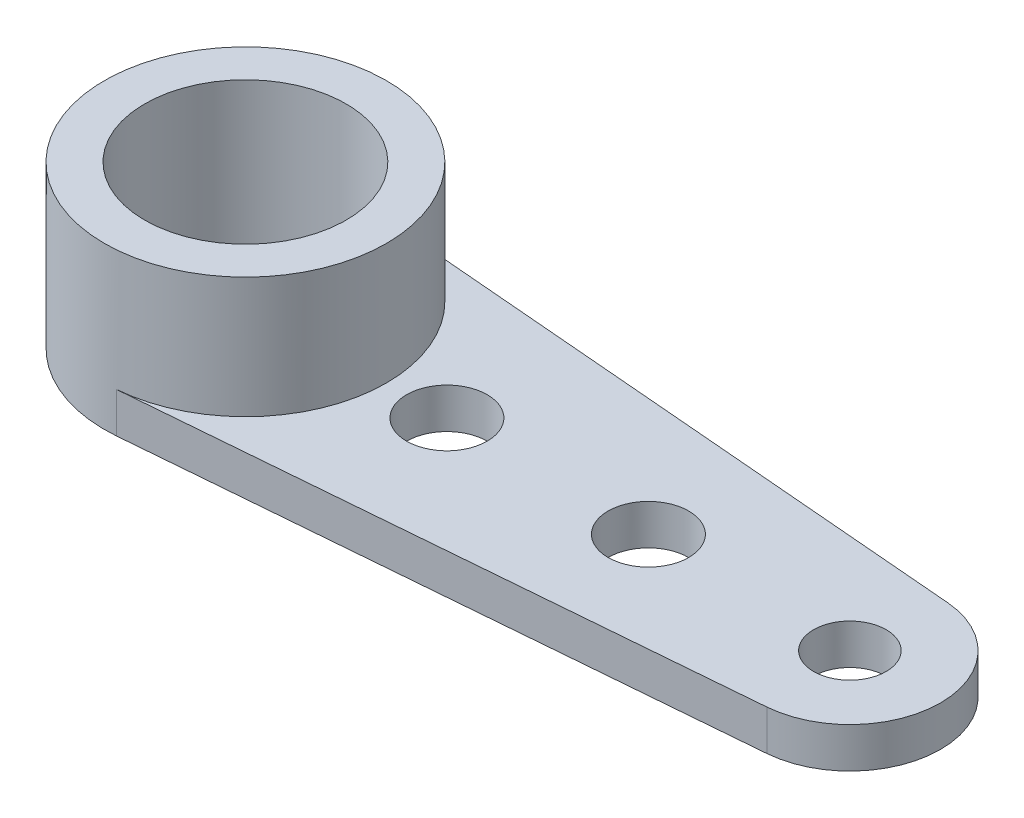
ISO-10303-21;
HEADER;
FILE_DESCRIPTION(('STEP AP214'),'2;1');
FILE_NAME('part.step','',(''),(''),'','','');
FILE_SCHEMA(('AUTOMOTIVE_DESIGN { 1 0 10303 214 1 1 1 1 }'));
ENDSEC;
DATA;
#1=APPLICATION_CONTEXT('core data for automotive mechanical design processes');
#2=APPLICATION_PROTOCOL_DEFINITION('international standard','automotive_design',2000,#1);
#3=PRODUCT_CONTEXT('',#1,'mechanical');
#4=PRODUCT('Part','Part','',(#3));
#5=PRODUCT_RELATED_PRODUCT_CATEGORY('part','',(#4));
#6=PRODUCT_DEFINITION_FORMATION('','',#4);
#7=PRODUCT_DEFINITION_CONTEXT('part definition',#1,'design');
#8=PRODUCT_DEFINITION('design','',#6,#7);
#9=PRODUCT_DEFINITION_SHAPE('','',#8);
#10=(LENGTH_UNIT() NAMED_UNIT(*) SI_UNIT(.MILLI.,.METRE.));
#11=(NAMED_UNIT(*) PLANE_ANGLE_UNIT() SI_UNIT($,.RADIAN.));
#12=(NAMED_UNIT(*) SI_UNIT($,.STERADIAN.) SOLID_ANGLE_UNIT());
#13=UNCERTAINTY_MEASURE_WITH_UNIT(LENGTH_MEASURE(1.E-05),#10,'distance_accuracy_value','');
#14=(GEOMETRIC_REPRESENTATION_CONTEXT(3) GLOBAL_UNCERTAINTY_ASSIGNED_CONTEXT((#13)) GLOBAL_UNIT_ASSIGNED_CONTEXT((#10,
#11,#12)) REPRESENTATION_CONTEXT('',''));
#15=CARTESIAN_POINT('',(0.,0.,0.));
#16=DIRECTION('',(0.,0.,1.));
#17=DIRECTION('',(1.,0.,0.));
#18=AXIS2_PLACEMENT_3D('',#15,#16,#17);
#19=CARTESIAN_POINT('',(0.291666666666666,1.,3.48782605007124));
#20=DIRECTION('',(-0.0833333333333333,0.,-0.996521728591783));
#21=DIRECTION('',(-0.996521728591783,0.,0.0833333333333333));
#22=AXIS2_PLACEMENT_3D('',#19,#20,#21);
#23=PLANE('',#22);
#24=DIRECTION('',(0.996521728591783,0.,-0.0833333333333333));
#25=VECTOR('',#24,1.);
#26=CARTESIAN_POINT('',(0.291666666666666,0.,3.48782605007124));
#27=LINE('',#26,#25);
#28=CARTESIAN_POINT('',(0.291666666666667,0.,3.48782605007124));
#29=VERTEX_POINT('',#28);
#30=CARTESIAN_POINT('',(15.1875,0.,2.24217388933151));
#31=VERTEX_POINT('',#30);
#32=EDGE_CURVE('E119',#29,#31,#27,.T.);
#33=ORIENTED_EDGE('',*,*,#32,.T.);
#34=DIRECTION('',(0.,-1.,0.));
#35=VECTOR('',#34,1.);
#36=CARTESIAN_POINT('',(15.1875,1.,2.24217388933151));
#37=LINE('',#36,#35);
#38=CARTESIAN_POINT('',(15.1875,1.,2.24217388933151));
#39=VERTEX_POINT('',#38);
#40=EDGE_CURVE('E13',#39,#31,#37,.T.);
#41=ORIENTED_EDGE('',*,*,#40,.F.);
#42=DIRECTION('',(0.996521728591783,0.,-0.0833333333333333));
#43=VECTOR('',#42,1.);
#44=CARTESIAN_POINT('',(0.291666666666666,1.,3.48782605007124));
#45=LINE('',#44,#43);
#46=CARTESIAN_POINT('',(0.291666666666667,1.,3.48782605007124));
#47=VERTEX_POINT('',#46);
#48=EDGE_CURVE('E102',#47,#39,#45,.T.);
#49=ORIENTED_EDGE('',*,*,#48,.F.);
#50=DIRECTION('',(0.,-1.,0.));
#51=VECTOR('',#50,1.);
#52=CARTESIAN_POINT('',(0.291666666666667,1.,3.48782605007124));
#53=LINE('',#52,#51);
#54=EDGE_CURVE('E104',#47,#29,#53,.T.);
#55=ORIENTED_EDGE('',*,*,#54,.T.);
#56=EDGE_LOOP('',(#33,#41,#49,#55));
#57=FACE_BOUND('',#56,.T.);
#58=ADVANCED_FACE('F56',(#57),#23,.F.);
#59=CARTESIAN_POINT('',(15.,1.,0.));
#60=DIRECTION('',(0.,-1.,0.));
#61=DIRECTION('',(0.,0.,-1.));
#62=AXIS2_PLACEMENT_3D('',#59,#60,#61);
#63=CYLINDRICAL_SURFACE('',#62,2.25);
#64=CARTESIAN_POINT('',(15.,0.,0.));
#65=DIRECTION('',(0.,1.,0.));
#66=DIRECTION('',(0.,0.,1.));
#67=AXIS2_PLACEMENT_3D('',#64,#65,#66);
#68=CIRCLE('',#67,2.25);
#69=CARTESIAN_POINT('',(15.1875,0.,-2.24217388933151));
#70=VERTEX_POINT('',#69);
#71=EDGE_CURVE('E129',#31,#70,#68,.T.);
#72=ORIENTED_EDGE('',*,*,#71,.T.);
#73=DIRECTION('',(0.,-1.,0.));
#74=VECTOR('',#73,1.);
#75=CARTESIAN_POINT('',(15.1875,1.,-2.24217388933151));
#76=LINE('',#75,#74);
#77=CARTESIAN_POINT('',(15.1875,1.,-2.24217388933151));
#78=VERTEX_POINT('',#77);
#79=EDGE_CURVE('E64',#78,#70,#76,.T.);
#80=ORIENTED_EDGE('',*,*,#79,.F.);
#81=CARTESIAN_POINT('',(15.,1.,0.));
#82=DIRECTION('',(0.,1.,0.));
#83=DIRECTION('',(0.,0.,1.));
#84=AXIS2_PLACEMENT_3D('',#81,#82,#83);
#85=CIRCLE('',#84,2.25);
#86=EDGE_CURVE('E96',#39,#78,#85,.T.);
#87=ORIENTED_EDGE('',*,*,#86,.F.);
#88=ORIENTED_EDGE('',*,*,#40,.T.);
#89=EDGE_LOOP('',(#72,#80,#87,#88));
#90=FACE_BOUND('',#89,.T.);
#91=ADVANCED_FACE('F137',(#90),#63,.T.);
#92=CARTESIAN_POINT('',(0.291666666666667,1.,-3.48782605007124));
#93=DIRECTION('',(0.0833333333333333,0.,-0.996521728591783));
#94=DIRECTION('',(-0.996521728591783,0.,-0.0833333333333333));
#95=AXIS2_PLACEMENT_3D('',#92,#93,#94);
#96=PLANE('',#95);
#97=DIRECTION('',(0.996521728591783,0.,0.0833333333333333));
#98=VECTOR('',#97,1.);
#99=CARTESIAN_POINT('',(0.291666666666667,0.,-3.48782605007124));
#100=LINE('',#99,#98);
#101=CARTESIAN_POINT('',(0.291666666666667,0.,-3.48782605007124));
#102=VERTEX_POINT('',#101);
#103=EDGE_CURVE('E132',#102,#70,#100,.T.);
#104=ORIENTED_EDGE('',*,*,#103,.F.);
#105=DIRECTION('',(0.,-1.,0.));
#106=VECTOR('',#105,1.);
#107=CARTESIAN_POINT('',(0.291666666666667,1.,-3.48782605007124));
#108=LINE('',#107,#106);
#109=CARTESIAN_POINT('',(0.291666666666667,1.,-3.48782605007124));
#110=VERTEX_POINT('',#109);
#111=EDGE_CURVE('E72',#110,#102,#108,.T.);
#112=ORIENTED_EDGE('',*,*,#111,.F.);
#113=DIRECTION('',(0.996521728591783,0.,0.0833333333333333));
#114=VECTOR('',#113,1.);
#115=CARTESIAN_POINT('',(0.291666666666667,1.,-3.48782605007124));
#116=LINE('',#115,#114);
#117=EDGE_CURVE('E112',#110,#78,#116,.T.);
#118=ORIENTED_EDGE('',*,*,#117,.T.);
#119=ORIENTED_EDGE('',*,*,#79,.T.);
#120=EDGE_LOOP('',(#104,#112,#118,#119));
#121=FACE_BOUND('',#120,.T.);
#122=ADVANCED_FACE('F136',(#121),#96,.T.);
#123=CARTESIAN_POINT('',(0.,1.,0.));
#124=DIRECTION('',(0.,-1.,0.));
#125=DIRECTION('',(0.,0.,-1.));
#126=AXIS2_PLACEMENT_3D('',#123,#124,#125);
#127=CYLINDRICAL_SURFACE('',#126,3.5);
#128=CARTESIAN_POINT('',(0.,0.,0.));
#129=DIRECTION('',(0.,1.,0.));
#130=DIRECTION('',(0.,0.,1.));
#131=AXIS2_PLACEMENT_3D('',#128,#129,#130);
#132=CIRCLE('',#131,3.5);
#133=EDGE_CURVE('E91',#102,#29,#132,.T.);
#134=ORIENTED_EDGE('',*,*,#133,.T.);
#135=ORIENTED_EDGE('',*,*,#54,.F.);
#136=CARTESIAN_POINT('',(0.,1.,0.));
#137=DIRECTION('',(0.,1.,0.));
#138=DIRECTION('',(0.,0.,1.));
#139=AXIS2_PLACEMENT_3D('',#136,#137,#138);
#140=CIRCLE('',#139,3.5);
#141=EDGE_CURVE('E111',#47,#110,#140,.T.);
#142=ORIENTED_EDGE('',*,*,#141,.T.);
#143=ORIENTED_EDGE('',*,*,#111,.T.);
#144=EDGE_LOOP('',(#134,#135,#142,#143));
#145=FACE_BOUND('',#144,.T.);
#146=CARTESIAN_POINT('',(0.,4.,0.));
#147=DIRECTION('',(0.,1.,0.));
#148=DIRECTION('',(0.,0.,1.));
#149=AXIS2_PLACEMENT_3D('',#146,#147,#148);
#150=CIRCLE('',#149,3.5);
#151=CARTESIAN_POINT('',(0.,4.,3.5));
#152=VERTEX_POINT('',#151);
#153=EDGE_CURVE('E115',#152,#152,#150,.T.);
#154=ORIENTED_EDGE('',*,*,#153,.F.);
#155=EDGE_LOOP('',(#154));
#156=FACE_BOUND('',#155,.T.);
#157=ADVANCED_FACE('F109',(#145,#156),#127,.T.);
#158=CARTESIAN_POINT('',(0.,1.,0.));
#159=DIRECTION('',(0.,1.,0.));
#160=DIRECTION('',(0.,0.,1.));
#161=AXIS2_PLACEMENT_3D('',#158,#159,#160);
#162=PLANE('',#161);
#163=CARTESIAN_POINT('',(5.,1.,0.));
#164=DIRECTION('',(0.,1.,0.));
#165=DIRECTION('',(0.,0.,1.));
#166=AXIS2_PLACEMENT_3D('',#163,#164,#165);
#167=CIRCLE('',#166,1.);
#168=CARTESIAN_POINT('',(5.,1.,1.));
#169=VERTEX_POINT('',#168);
#170=EDGE_CURVE('E236',#169,#169,#167,.T.);
#171=ORIENTED_EDGE('',*,*,#170,.F.);
#172=EDGE_LOOP('',(#171));
#173=FACE_BOUND('',#172,.T.);
#174=CARTESIAN_POINT('',(10.,1.,0.));
#175=DIRECTION('',(0.,1.,0.));
#176=DIRECTION('',(0.,0.,1.));
#177=AXIS2_PLACEMENT_3D('',#174,#175,#176);
#178=CIRCLE('',#177,1.);
#179=CARTESIAN_POINT('',(10.,1.,1.));
#180=VERTEX_POINT('',#179);
#181=EDGE_CURVE('E239',#180,#180,#178,.T.);
#182=ORIENTED_EDGE('',*,*,#181,.F.);
#183=EDGE_LOOP('',(#182));
#184=FACE_BOUND('',#183,.T.);
#185=CARTESIAN_POINT('',(15.,1.,0.));
#186=DIRECTION('',(0.,1.,0.));
#187=DIRECTION('',(0.,0.,1.));
#188=AXIS2_PLACEMENT_3D('',#185,#186,#187);
#189=CIRCLE('',#188,0.9);
#190=CARTESIAN_POINT('',(15.,1.,0.9));
#191=VERTEX_POINT('',#190);
#192=EDGE_CURVE('E251',#191,#191,#189,.T.);
#193=ORIENTED_EDGE('',*,*,#192,.F.);
#194=EDGE_LOOP('',(#193));
#195=FACE_BOUND('',#194,.T.);
#196=ORIENTED_EDGE('',*,*,#141,.F.);
#197=ORIENTED_EDGE('',*,*,#48,.T.);
#198=ORIENTED_EDGE('',*,*,#86,.T.);
#199=ORIENTED_EDGE('',*,*,#117,.F.);
#200=EDGE_LOOP('',(#196,#197,#198,#199));
#201=FACE_BOUND('',#200,.T.);
#202=ADVANCED_FACE('F114',(#173,#184,#195,#201),#162,.T.);
#203=CARTESIAN_POINT('',(0.,0.,0.));
#204=DIRECTION('',(0.,1.,0.));
#205=DIRECTION('',(0.,0.,1.));
#206=AXIS2_PLACEMENT_3D('',#203,#204,#205);
#207=PLANE('',#206);
#208=CARTESIAN_POINT('',(5.,0.,0.));
#209=DIRECTION('',(0.,-1.,0.));
#210=DIRECTION('',(0.,0.,-1.));
#211=AXIS2_PLACEMENT_3D('',#208,#209,#210);
#212=CIRCLE('',#211,1.);
#213=CARTESIAN_POINT('',(5.,0.,-1.));
#214=VERTEX_POINT('',#213);
#215=EDGE_CURVE('E238',#214,#214,#212,.T.);
#216=ORIENTED_EDGE('',*,*,#215,.F.);
#217=EDGE_LOOP('',(#216));
#218=FACE_BOUND('',#217,.T.);
#219=CARTESIAN_POINT('',(10.,0.,0.));
#220=DIRECTION('',(0.,-1.,0.));
#221=DIRECTION('',(0.,0.,-1.));
#222=AXIS2_PLACEMENT_3D('',#219,#220,#221);
#223=CIRCLE('',#222,1.);
#224=CARTESIAN_POINT('',(10.,0.,-1.));
#225=VERTEX_POINT('',#224);
#226=EDGE_CURVE('E240',#225,#225,#223,.T.);
#227=ORIENTED_EDGE('',*,*,#226,.F.);
#228=EDGE_LOOP('',(#227));
#229=FACE_BOUND('',#228,.T.);
#230=CARTESIAN_POINT('',(15.,0.,0.));
#231=DIRECTION('',(0.,-1.,0.));
#232=DIRECTION('',(0.,0.,-1.));
#233=AXIS2_PLACEMENT_3D('',#230,#231,#232);
#234=CIRCLE('',#233,0.9);
#235=CARTESIAN_POINT('',(15.,0.,-0.9));
#236=VERTEX_POINT('',#235);
#237=EDGE_CURVE('E248',#236,#236,#234,.T.);
#238=ORIENTED_EDGE('',*,*,#237,.F.);
#239=EDGE_LOOP('',(#238));
#240=FACE_BOUND('',#239,.T.);
#241=CARTESIAN_POINT('',(0.,0.,0.));
#242=DIRECTION('',(0.,1.,0.));
#243=DIRECTION('',(0.,0.,1.));
#244=AXIS2_PLACEMENT_3D('',#241,#242,#243);
#245=CIRCLE('',#244,2.5);
#246=CARTESIAN_POINT('',(0.,0.,2.5));
#247=VERTEX_POINT('',#246);
#248=EDGE_CURVE('E116',#247,#247,#245,.T.);
#249=ORIENTED_EDGE('',*,*,#248,.T.);
#250=EDGE_LOOP('',(#249));
#251=FACE_BOUND('',#250,.T.);
#252=ORIENTED_EDGE('',*,*,#32,.F.);
#253=ORIENTED_EDGE('',*,*,#133,.F.);
#254=ORIENTED_EDGE('',*,*,#103,.T.);
#255=ORIENTED_EDGE('',*,*,#71,.F.);
#256=EDGE_LOOP('',(#252,#253,#254,#255));
#257=FACE_BOUND('',#256,.T.);
#258=ADVANCED_FACE('F139',(#218,#229,#240,#251,#257),#207,.F.);
#259=CARTESIAN_POINT('',(0.,4.,0.));
#260=DIRECTION('',(0.,1.,0.));
#261=DIRECTION('',(0.,0.,1.));
#262=AXIS2_PLACEMENT_3D('',#259,#260,#261);
#263=PLANE('',#262);
#264=CARTESIAN_POINT('',(0.,4.,0.));
#265=DIRECTION('',(0.,1.,0.));
#266=DIRECTION('',(0.,0.,1.));
#267=AXIS2_PLACEMENT_3D('',#264,#265,#266);
#268=CIRCLE('',#267,2.5);
#269=CARTESIAN_POINT('',(0.,4.,2.5));
#270=VERTEX_POINT('',#269);
#271=EDGE_CURVE('E122',#270,#270,#268,.T.);
#272=ORIENTED_EDGE('',*,*,#271,.F.);
#273=EDGE_LOOP('',(#272));
#274=FACE_BOUND('',#273,.T.);
#275=ORIENTED_EDGE('',*,*,#153,.T.);
#276=EDGE_LOOP('',(#275));
#277=FACE_BOUND('',#276,.T.);
#278=ADVANCED_FACE('F141',(#274,#277),#263,.T.);
#279=CARTESIAN_POINT('',(0.,0.,0.));
#280=DIRECTION('',(0.,1.,0.));
#281=DIRECTION('',(0.,0.,1.));
#282=AXIS2_PLACEMENT_3D('',#279,#280,#281);
#283=CYLINDRICAL_SURFACE('',#282,2.5);
#284=ORIENTED_EDGE('',*,*,#248,.F.);
#285=EDGE_LOOP('',(#284));
#286=FACE_BOUND('',#285,.T.);
#287=ORIENTED_EDGE('',*,*,#271,.T.);
#288=EDGE_LOOP('',(#287));
#289=FACE_BOUND('',#288,.T.);
#290=ADVANCED_FACE('F149',(#286,#289),#283,.F.);
#291=CARTESIAN_POINT('',(15.,4.,0.));
#292=DIRECTION('',(0.,-1.,0.));
#293=DIRECTION('',(0.,0.,-1.));
#294=AXIS2_PLACEMENT_3D('',#291,#292,#293);
#295=CYLINDRICAL_SURFACE('',#294,0.9);
#296=ORIENTED_EDGE('',*,*,#192,.T.);
#297=EDGE_LOOP('',(#296));
#298=FACE_BOUND('',#297,.T.);
#299=ORIENTED_EDGE('',*,*,#237,.T.);
#300=EDGE_LOOP('',(#299));
#301=FACE_BOUND('',#300,.T.);
#302=ADVANCED_FACE('F181',(#298,#301),#295,.F.);
#303=CARTESIAN_POINT('',(10.,4.,0.));
#304=DIRECTION('',(0.,-1.,0.));
#305=DIRECTION('',(0.,0.,-1.));
#306=AXIS2_PLACEMENT_3D('',#303,#304,#305);
#307=CYLINDRICAL_SURFACE('',#306,1.);
#308=ORIENTED_EDGE('',*,*,#181,.T.);
#309=EDGE_LOOP('',(#308));
#310=FACE_BOUND('',#309,.T.);
#311=ORIENTED_EDGE('',*,*,#226,.T.);
#312=EDGE_LOOP('',(#311));
#313=FACE_BOUND('',#312,.T.);
#314=ADVANCED_FACE('F188',(#310,#313),#307,.F.);
#315=CARTESIAN_POINT('',(5.,4.,0.));
#316=DIRECTION('',(0.,-1.,0.));
#317=DIRECTION('',(0.,0.,-1.));
#318=AXIS2_PLACEMENT_3D('',#315,#316,#317);
#319=CYLINDRICAL_SURFACE('',#318,1.);
#320=ORIENTED_EDGE('',*,*,#170,.T.);
#321=EDGE_LOOP('',(#320));
#322=FACE_BOUND('',#321,.T.);
#323=ORIENTED_EDGE('',*,*,#215,.T.);
#324=EDGE_LOOP('',(#323));
#325=FACE_BOUND('',#324,.T.);
#326=ADVANCED_FACE('F223',(#322,#325),#319,.F.);
#327=CLOSED_SHELL('',(#58,#91,#122,#157,#202,#258,#278,#290,#302,#314,#326));
#328=MANIFOLD_SOLID_BREP('B2',#327);
#329=ADVANCED_BREP_SHAPE_REPRESENTATION('',(#18,#328),#14);
#330=SHAPE_DEFINITION_REPRESENTATION(#9,#329);
ENDSEC;
END-ISO-10303-21;
